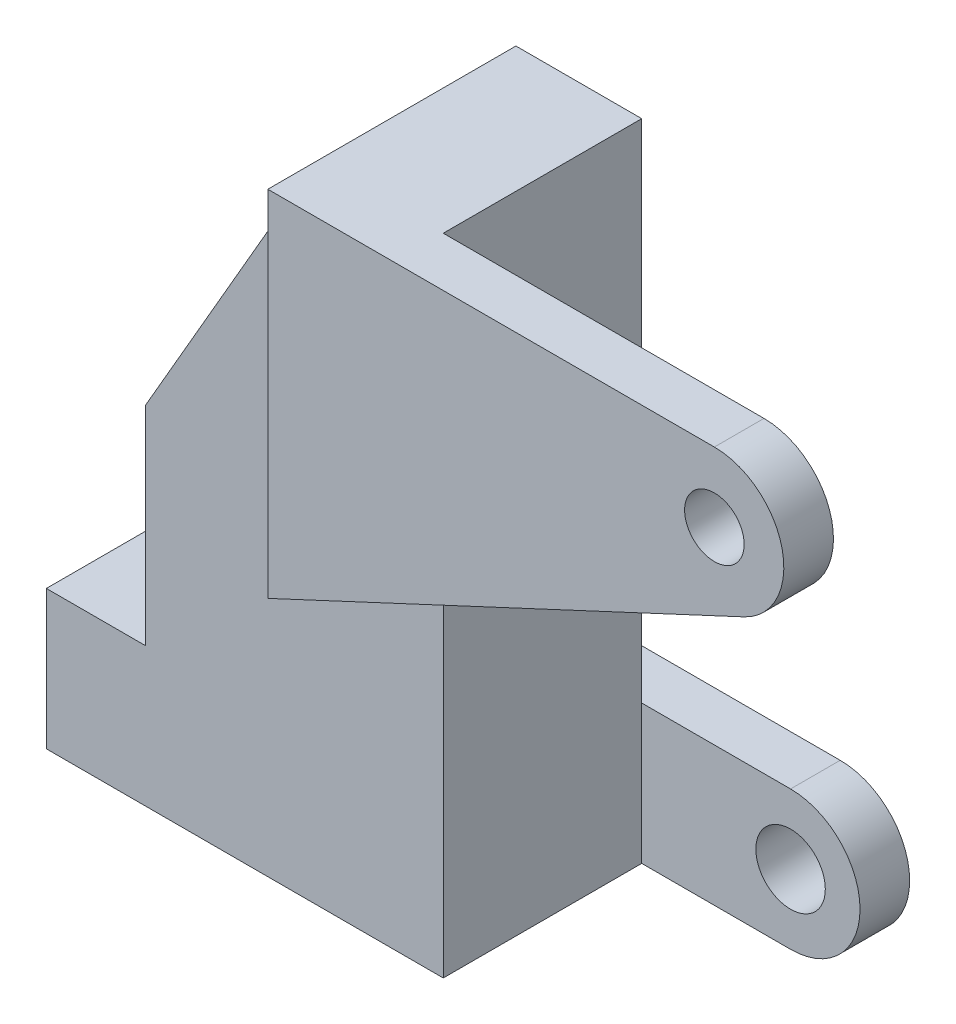
ISO-10303-21;
HEADER;
FILE_DESCRIPTION(('STEP AP214'),'2;1');
FILE_NAME('part.step','',(''),(''),'','','');
FILE_SCHEMA(('AUTOMOTIVE_DESIGN { 1 0 10303 214 1 1 1 1 }'));
ENDSEC;
DATA;
#1=APPLICATION_CONTEXT('core data for automotive mechanical design processes');
#2=APPLICATION_PROTOCOL_DEFINITION('international standard','automotive_design',2000,#1);
#3=PRODUCT_CONTEXT('',#1,'mechanical');
#4=PRODUCT('Part','Part','',(#3));
#5=PRODUCT_RELATED_PRODUCT_CATEGORY('part','',(#4));
#6=PRODUCT_DEFINITION_FORMATION('','',#4);
#7=PRODUCT_DEFINITION_CONTEXT('part definition',#1,'design');
#8=PRODUCT_DEFINITION('design','',#6,#7);
#9=PRODUCT_DEFINITION_SHAPE('','',#8);
#10=(LENGTH_UNIT() NAMED_UNIT(*) SI_UNIT(.MILLI.,.METRE.));
#11=(NAMED_UNIT(*) PLANE_ANGLE_UNIT() SI_UNIT($,.RADIAN.));
#12=(NAMED_UNIT(*) SI_UNIT($,.STERADIAN.) SOLID_ANGLE_UNIT());
#13=UNCERTAINTY_MEASURE_WITH_UNIT(LENGTH_MEASURE(1.E-05),#10,'distance_accuracy_value','');
#14=(GEOMETRIC_REPRESENTATION_CONTEXT(3) GLOBAL_UNCERTAINTY_ASSIGNED_CONTEXT((#13)) GLOBAL_UNIT_ASSIGNED_CONTEXT((#10,
#11,#12)) REPRESENTATION_CONTEXT('',''));
#15=CARTESIAN_POINT('',(0.,0.,0.));
#16=DIRECTION('',(0.,0.,1.));
#17=DIRECTION('',(1.,0.,0.));
#18=AXIS2_PLACEMENT_3D('',#15,#16,#17);
#19=CARTESIAN_POINT('',(0.,0.,0.));
#20=DIRECTION('',(0.,0.,1.));
#21=DIRECTION('',(1.,0.,0.));
#22=AXIS2_PLACEMENT_3D('',#19,#20,#21);
#23=PLANE('',#22);
#24=DIRECTION('',(1.,0.,0.));
#25=VECTOR('',#24,1.);
#26=CARTESIAN_POINT('',(0.,65.,0.));
#27=LINE('',#26,#25);
#28=CARTESIAN_POINT('',(27.3205080756888,65.,0.));
#29=VERTEX_POINT('',#28);
#30=CARTESIAN_POINT('',(40.,65.,0.));
#31=VERTEX_POINT('',#30);
#32=EDGE_CURVE('E196',#29,#31,#27,.T.);
#33=ORIENTED_EDGE('',*,*,#32,.T.);
#34=DIRECTION('',(0.,1.,0.));
#35=VECTOR('',#34,1.);
#36=CARTESIAN_POINT('',(40.,0.,0.));
#37=LINE('',#36,#35);
#38=CARTESIAN_POINT('',(40.,14.,0.));
#39=VERTEX_POINT('',#38);
#40=EDGE_CURVE('E172',#39,#31,#37,.T.);
#41=ORIENTED_EDGE('',*,*,#40,.F.);
#42=DIRECTION('',(1.,0.,0.));
#43=VECTOR('',#42,1.);
#44=CARTESIAN_POINT('',(0.,14.,0.));
#45=LINE('',#44,#43);
#46=CARTESIAN_POINT('',(10.,14.,0.));
#47=VERTEX_POINT('',#46);
#48=EDGE_CURVE('E286',#47,#39,#45,.T.);
#49=ORIENTED_EDGE('',*,*,#48,.F.);
#50=DIRECTION('',(0.,1.,0.));
#51=VECTOR('',#50,1.);
#52=CARTESIAN_POINT('',(10.,0.,0.));
#53=LINE('',#52,#51);
#54=CARTESIAN_POINT('',(10.,35.,0.));
#55=VERTEX_POINT('',#54);
#56=EDGE_CURVE('E204',#47,#55,#53,.T.);
#57=ORIENTED_EDGE('',*,*,#56,.T.);
#58=DIRECTION('',(0.500000000000001,0.866025403784438,0.));
#59=VECTOR('',#58,1.);
#60=CARTESIAN_POINT('',(-7.65544456622771,4.41987298107784,0.));
#61=LINE('',#60,#59);
#62=EDGE_CURVE('E203',#55,#29,#61,.T.);
#63=ORIENTED_EDGE('',*,*,#62,.T.);
#64=EDGE_LOOP('',(#33,#41,#49,#57,#63));
#65=FACE_BOUND('',#64,.T.);
#66=ADVANCED_FACE('F43',(#65),#23,.F.);
#67=CARTESIAN_POINT('',(0.,65.,20.));
#68=DIRECTION('',(0.,1.,0.));
#69=DIRECTION('',(0.,0.,1.));
#70=AXIS2_PLACEMENT_3D('',#67,#68,#69);
#71=PLANE('',#70);
#72=DIRECTION('',(1.,0.,0.));
#73=VECTOR('',#72,1.);
#74=CARTESIAN_POINT('',(0.,65.,20.));
#75=LINE('',#74,#73);
#76=CARTESIAN_POINT('',(40.,65.,20.));
#77=VERTEX_POINT('',#76);
#78=CARTESIAN_POINT('',(72.3205080756888,65.,20.));
#79=VERTEX_POINT('',#78);
#80=EDGE_CURVE('E59',#77,#79,#75,.T.);
#81=ORIENTED_EDGE('',*,*,#80,.F.);
#82=DIRECTION('',(0.,0.,-1.));
#83=VECTOR('',#82,1.);
#84=CARTESIAN_POINT('',(40.,65.,20.));
#85=LINE('',#84,#83);
#86=EDGE_CURVE('E266',#77,#31,#85,.T.);
#87=ORIENTED_EDGE('',*,*,#86,.T.);
#88=ORIENTED_EDGE('',*,*,#32,.F.);
#89=DIRECTION('',(0.,0.,-1.));
#90=VECTOR('',#89,1.);
#91=CARTESIAN_POINT('',(27.3205080756888,65.,20.));
#92=LINE('',#91,#90);
#93=CARTESIAN_POINT('',(27.3205080756888,65.,20.));
#94=VERTEX_POINT('',#93);
#95=EDGE_CURVE('E226',#94,#29,#92,.T.);
#96=ORIENTED_EDGE('',*,*,#95,.F.);
#97=DIRECTION('',(0.,0.,-1.));
#98=VECTOR('',#97,1.);
#99=CARTESIAN_POINT('',(27.3205080756888,65.,25.));
#100=LINE('',#99,#98);
#101=CARTESIAN_POINT('',(27.3205080756888,65.,25.));
#102=VERTEX_POINT('',#101);
#103=EDGE_CURVE('E180',#102,#94,#100,.T.);
#104=ORIENTED_EDGE('',*,*,#103,.F.);
#105=DIRECTION('',(1.,0.,0.));
#106=VECTOR('',#105,1.);
#107=CARTESIAN_POINT('',(0.,65.,25.));
#108=LINE('',#107,#106);
#109=CARTESIAN_POINT('',(72.3205080756888,65.,25.));
#110=VERTEX_POINT('',#109);
#111=EDGE_CURVE('E311',#102,#110,#108,.T.);
#112=ORIENTED_EDGE('',*,*,#111,.T.);
#113=DIRECTION('',(0.,0.,-1.));
#114=VECTOR('',#113,1.);
#115=CARTESIAN_POINT('',(72.3205080756888,65.,25.));
#116=LINE('',#115,#114);
#117=EDGE_CURVE('E174',#110,#79,#116,.T.);
#118=ORIENTED_EDGE('',*,*,#117,.T.);
#119=EDGE_LOOP('',(#81,#87,#88,#96,#104,#112,#118));
#120=FACE_BOUND('',#119,.T.);
#121=ADVANCED_FACE('F240',(#120),#71,.T.);
#122=CARTESIAN_POINT('',(40.,0.,20.));
#123=DIRECTION('',(-1.,0.,0.));
#124=DIRECTION('',(0.,0.,1.));
#125=AXIS2_PLACEMENT_3D('',#122,#123,#124);
#126=PLANE('',#125);
#127=ORIENTED_EDGE('',*,*,#40,.T.);
#128=ORIENTED_EDGE('',*,*,#86,.F.);
#129=DIRECTION('',(0.,1.,0.));
#130=VECTOR('',#129,1.);
#131=CARTESIAN_POINT('',(40.,0.,20.));
#132=LINE('',#131,#130);
#133=CARTESIAN_POINT('',(40.,35.2050541361085,20.));
#134=VERTEX_POINT('',#133);
#135=EDGE_CURVE('E264',#134,#77,#132,.T.);
#136=ORIENTED_EDGE('',*,*,#135,.F.);
#137=DIRECTION('',(0.,1.,0.));
#138=VECTOR('',#137,1.);
#139=CARTESIAN_POINT('',(40.,0.,20.));
#140=LINE('',#139,#138);
#141=CARTESIAN_POINT('',(40.,0.,20.));
#142=VERTEX_POINT('',#141);
#143=EDGE_CURVE('E182',#142,#134,#140,.T.);
#144=ORIENTED_EDGE('',*,*,#143,.F.);
#145=DIRECTION('',(0.,0.,-1.));
#146=VECTOR('',#145,1.);
#147=CARTESIAN_POINT('',(40.,0.,20.));
#148=LINE('',#147,#146);
#149=CARTESIAN_POINT('',(40.,0.,0.));
#150=VERTEX_POINT('',#149);
#151=EDGE_CURVE('E191',#142,#150,#148,.T.);
#152=ORIENTED_EDGE('',*,*,#151,.T.);
#153=EDGE_CURVE('E175',#150,#39,#37,.T.);
#154=ORIENTED_EDGE('',*,*,#153,.T.);
#155=EDGE_LOOP('',(#127,#128,#136,#144,#152,#154));
#156=FACE_BOUND('',#155,.T.);
#157=ADVANCED_FACE('F44',(#156),#126,.F.);
#158=CARTESIAN_POINT('',(0.,0.,20.));
#159=DIRECTION('',(0.,0.,1.));
#160=DIRECTION('',(1.,0.,0.));
#161=AXIS2_PLACEMENT_3D('',#158,#159,#160);
#162=PLANE('',#161);
#163=ORIENTED_EDGE('',*,*,#143,.T.);
#164=DIRECTION('',(-0.906307787036651,-0.422618261740697,0.));
#165=VECTOR('',#164,1.);
#166=CARTESIAN_POINT('',(-6.34007023906516,13.596324504192,20.));
#167=LINE('',#166,#165);
#168=CARTESIAN_POINT('',(27.3205080756888,29.2925099502878,20.));
#169=VERTEX_POINT('',#168);
#170=EDGE_CURVE('E11',#134,#169,#167,.T.);
#171=ORIENTED_EDGE('',*,*,#170,.T.);
#172=DIRECTION('',(0.,1.,0.));
#173=VECTOR('',#172,1.);
#174=CARTESIAN_POINT('',(27.3205080756888,0.,20.));
#175=LINE('',#174,#173);
#176=EDGE_CURVE('E51',#169,#94,#175,.T.);
#177=ORIENTED_EDGE('',*,*,#176,.T.);
#178=DIRECTION('',(0.500000000000001,0.866025403784438,0.));
#179=VECTOR('',#178,1.);
#180=CARTESIAN_POINT('',(-7.65544456622771,4.41987298107784,20.));
#181=LINE('',#180,#179);
#182=CARTESIAN_POINT('',(10.,35.,20.));
#183=VERTEX_POINT('',#182);
#184=EDGE_CURVE('E181',#183,#94,#181,.T.);
#185=ORIENTED_EDGE('',*,*,#184,.F.);
#186=DIRECTION('',(0.,1.,0.));
#187=VECTOR('',#186,1.);
#188=CARTESIAN_POINT('',(10.,0.,20.));
#189=LINE('',#188,#187);
#190=CARTESIAN_POINT('',(10.,14.,20.));
#191=VERTEX_POINT('',#190);
#192=EDGE_CURVE('E187',#191,#183,#189,.T.);
#193=ORIENTED_EDGE('',*,*,#192,.F.);
#194=DIRECTION('',(-1.,0.,0.));
#195=VECTOR('',#194,1.);
#196=CARTESIAN_POINT('',(0.,14.,20.));
#197=LINE('',#196,#195);
#198=CARTESIAN_POINT('',(0.,14.,20.));
#199=VERTEX_POINT('',#198);
#200=EDGE_CURVE('E190',#191,#199,#197,.T.);
#201=ORIENTED_EDGE('',*,*,#200,.T.);
#202=DIRECTION('',(0.,-1.,0.));
#203=VECTOR('',#202,1.);
#204=CARTESIAN_POINT('',(0.,0.,20.));
#205=LINE('',#204,#203);
#206=CARTESIAN_POINT('',(0.,0.,20.));
#207=VERTEX_POINT('',#206);
#208=EDGE_CURVE('E195',#199,#207,#205,.T.);
#209=ORIENTED_EDGE('',*,*,#208,.T.);
#210=DIRECTION('',(1.,0.,0.));
#211=VECTOR('',#210,1.);
#212=CARTESIAN_POINT('',(0.,0.,20.));
#213=LINE('',#212,#211);
#214=EDGE_CURVE('E194',#207,#142,#213,.T.);
#215=ORIENTED_EDGE('',*,*,#214,.T.);
#216=EDGE_LOOP('',(#163,#171,#177,#185,#193,#201,#209,#215));
#217=FACE_BOUND('',#216,.T.);
#218=ADVANCED_FACE('F232',(#217),#162,.T.);
#219=CARTESIAN_POINT('',(-7.65544456622771,4.41987298107784,20.));
#220=DIRECTION('',(-0.866025403784438,0.500000000000001,0.));
#221=DIRECTION('',(-0.500000000000001,-0.866025403784438,0.));
#222=AXIS2_PLACEMENT_3D('',#219,#220,#221);
#223=PLANE('',#222);
#224=ORIENTED_EDGE('',*,*,#62,.F.);
#225=DIRECTION('',(0.,0.,-1.));
#226=VECTOR('',#225,1.);
#227=CARTESIAN_POINT('',(10.,35.,20.));
#228=LINE('',#227,#226);
#229=EDGE_CURVE('E221',#183,#55,#228,.T.);
#230=ORIENTED_EDGE('',*,*,#229,.F.);
#231=ORIENTED_EDGE('',*,*,#184,.T.);
#232=ORIENTED_EDGE('',*,*,#95,.T.);
#233=EDGE_LOOP('',(#224,#230,#231,#232));
#234=FACE_BOUND('',#233,.T.);
#235=ADVANCED_FACE('F244',(#234),#223,.T.);
#236=CARTESIAN_POINT('',(10.,0.,20.));
#237=DIRECTION('',(-1.,0.,0.));
#238=DIRECTION('',(0.,-1.,0.));
#239=AXIS2_PLACEMENT_3D('',#236,#237,#238);
#240=PLANE('',#239);
#241=ORIENTED_EDGE('',*,*,#56,.F.);
#242=DIRECTION('',(0.,0.,-1.));
#243=VECTOR('',#242,1.);
#244=CARTESIAN_POINT('',(10.,14.,20.));
#245=LINE('',#244,#243);
#246=EDGE_CURVE('E222',#191,#47,#245,.T.);
#247=ORIENTED_EDGE('',*,*,#246,.F.);
#248=ORIENTED_EDGE('',*,*,#192,.T.);
#249=ORIENTED_EDGE('',*,*,#229,.T.);
#250=EDGE_LOOP('',(#241,#247,#248,#249));
#251=FACE_BOUND('',#250,.T.);
#252=ADVANCED_FACE('F247',(#251),#240,.T.);
#253=CARTESIAN_POINT('',(0.,14.,20.));
#254=DIRECTION('',(0.,-1.,0.));
#255=DIRECTION('',(0.,0.,-1.));
#256=AXIS2_PLACEMENT_3D('',#253,#254,#255);
#257=PLANE('',#256);
#258=DIRECTION('',(-1.,0.,0.));
#259=VECTOR('',#258,1.);
#260=CARTESIAN_POINT('',(0.,14.,0.));
#261=LINE('',#260,#259);
#262=CARTESIAN_POINT('',(0.,14.,0.));
#263=VERTEX_POINT('',#262);
#264=EDGE_CURVE('E210',#47,#263,#261,.T.);
#265=ORIENTED_EDGE('',*,*,#264,.T.);
#266=DIRECTION('',(0.,0.,-1.));
#267=VECTOR('',#266,1.);
#268=CARTESIAN_POINT('',(0.,14.,20.));
#269=LINE('',#268,#267);
#270=EDGE_CURVE('E217',#199,#263,#269,.T.);
#271=ORIENTED_EDGE('',*,*,#270,.F.);
#272=ORIENTED_EDGE('',*,*,#200,.F.);
#273=ORIENTED_EDGE('',*,*,#246,.T.);
#274=EDGE_LOOP('',(#265,#271,#272,#273));
#275=FACE_BOUND('',#274,.T.);
#276=ADVANCED_FACE('F252',(#275),#257,.F.);
#277=CARTESIAN_POINT('',(0.,0.,20.));
#278=DIRECTION('',(1.,0.,0.));
#279=DIRECTION('',(0.,0.,-1.));
#280=AXIS2_PLACEMENT_3D('',#277,#278,#279);
#281=PLANE('',#280);
#282=DIRECTION('',(0.,-1.,0.));
#283=VECTOR('',#282,1.);
#284=CARTESIAN_POINT('',(0.,0.,0.));
#285=LINE('',#284,#283);
#286=CARTESIAN_POINT('',(0.,0.,0.));
#287=VERTEX_POINT('',#286);
#288=EDGE_CURVE('E207',#263,#287,#285,.T.);
#289=ORIENTED_EDGE('',*,*,#288,.T.);
#290=DIRECTION('',(0.,0.,-1.));
#291=VECTOR('',#290,1.);
#292=CARTESIAN_POINT('',(0.,0.,20.));
#293=LINE('',#292,#291);
#294=EDGE_CURVE('E214',#207,#287,#293,.T.);
#295=ORIENTED_EDGE('',*,*,#294,.F.);
#296=ORIENTED_EDGE('',*,*,#208,.F.);
#297=ORIENTED_EDGE('',*,*,#270,.T.);
#298=EDGE_LOOP('',(#289,#295,#296,#297));
#299=FACE_BOUND('',#298,.T.);
#300=ADVANCED_FACE('F258',(#299),#281,.F.);
#301=CARTESIAN_POINT('',(0.,0.,20.));
#302=DIRECTION('',(0.,1.,0.));
#303=DIRECTION('',(0.,0.,1.));
#304=AXIS2_PLACEMENT_3D('',#301,#302,#303);
#305=PLANE('',#304);
#306=DIRECTION('',(1.,0.,0.));
#307=VECTOR('',#306,1.);
#308=CARTESIAN_POINT('',(0.,0.,0.));
#309=LINE('',#308,#307);
#310=CARTESIAN_POINT('',(10.,0.,0.));
#311=VERTEX_POINT('',#310);
#312=EDGE_CURVE('E184',#287,#311,#309,.T.);
#313=ORIENTED_EDGE('',*,*,#312,.T.);
#314=DIRECTION('',(0.,0.,1.));
#315=VECTOR('',#314,1.);
#316=CARTESIAN_POINT('',(10.,0.,-5.));
#317=LINE('',#316,#315);
#318=CARTESIAN_POINT('',(10.,0.,-5.));
#319=VERTEX_POINT('',#318);
#320=EDGE_CURVE('E67',#319,#311,#317,.T.);
#321=ORIENTED_EDGE('',*,*,#320,.F.);
#322=DIRECTION('',(1.,0.,0.));
#323=VECTOR('',#322,1.);
#324=CARTESIAN_POINT('',(0.,0.,-5.));
#325=LINE('',#324,#323);
#326=CARTESIAN_POINT('',(55.,0.,-5.));
#327=VERTEX_POINT('',#326);
#328=EDGE_CURVE('E278',#319,#327,#325,.T.);
#329=ORIENTED_EDGE('',*,*,#328,.T.);
#330=DIRECTION('',(0.,0.,1.));
#331=VECTOR('',#330,1.);
#332=CARTESIAN_POINT('',(55.,0.,-5.));
#333=LINE('',#332,#331);
#334=CARTESIAN_POINT('',(55.,0.,0.));
#335=VERTEX_POINT('',#334);
#336=EDGE_CURVE('E308',#327,#335,#333,.T.);
#337=ORIENTED_EDGE('',*,*,#336,.T.);
#338=DIRECTION('',(1.,0.,0.));
#339=VECTOR('',#338,1.);
#340=CARTESIAN_POINT('',(0.,0.,0.));
#341=LINE('',#340,#339);
#342=EDGE_CURVE('E293',#150,#335,#341,.T.);
#343=ORIENTED_EDGE('',*,*,#342,.F.);
#344=ORIENTED_EDGE('',*,*,#151,.F.);
#345=ORIENTED_EDGE('',*,*,#214,.F.);
#346=ORIENTED_EDGE('',*,*,#294,.T.);
#347=EDGE_LOOP('',(#313,#321,#329,#337,#343,#344,#345,#346));
#348=FACE_BOUND('',#347,.T.);
#349=ADVANCED_FACE('F261',(#348),#305,.F.);
#350=ORIENTED_EDGE('',*,*,#264,.F.);
#351=DIRECTION('',(0.,-1.,0.));
#352=VECTOR('',#351,1.);
#353=CARTESIAN_POINT('',(10.,0.,0.));
#354=LINE('',#353,#352);
#355=EDGE_CURVE('E291',#47,#311,#354,.T.);
#356=ORIENTED_EDGE('',*,*,#355,.T.);
#357=ORIENTED_EDGE('',*,*,#312,.F.);
#358=ORIENTED_EDGE('',*,*,#288,.F.);
#359=EDGE_LOOP('',(#350,#356,#357,#358));
#360=FACE_BOUND('',#359,.T.);
#361=ADVANCED_FACE('F332',(#360),#23,.F.);
#362=CARTESIAN_POINT('',(-6.34007023906516,13.596324504192,25.));
#363=DIRECTION('',(-0.422618261740697,0.906307787036651,0.));
#364=DIRECTION('',(-0.906307787036651,-0.422618261740697,0.));
#365=AXIS2_PLACEMENT_3D('',#362,#363,#364);
#366=PLANE('',#365);
#367=ORIENTED_EDGE('',*,*,#170,.F.);
#368=DIRECTION('',(0.906307787036651,0.422618261740697,0.));
#369=VECTOR('',#368,1.);
#370=CARTESIAN_POINT('',(-6.34007023906516,13.596324504192,20.));
#371=LINE('',#370,#369);
#372=CARTESIAN_POINT('',(75.2788359078737,51.6558454907434,20.));
#373=VERTEX_POINT('',#372);
#374=EDGE_CURVE('E153',#134,#373,#371,.T.);
#375=ORIENTED_EDGE('',*,*,#374,.T.);
#376=DIRECTION('',(0.,0.,-1.));
#377=VECTOR('',#376,1.);
#378=CARTESIAN_POINT('',(75.2788359078737,51.6558454907434,25.));
#379=LINE('',#378,#377);
#380=CARTESIAN_POINT('',(75.2788359078737,51.6558454907434,25.));
#381=VERTEX_POINT('',#380);
#382=EDGE_CURVE('E164',#381,#373,#379,.T.);
#383=ORIENTED_EDGE('',*,*,#382,.F.);
#384=DIRECTION('',(0.906307787036651,0.422618261740697,0.));
#385=VECTOR('',#384,1.);
#386=CARTESIAN_POINT('',(-6.34007023906516,13.596324504192,25.));
#387=LINE('',#386,#385);
#388=CARTESIAN_POINT('',(27.3205080756888,29.2925099502878,25.));
#389=VERTEX_POINT('',#388);
#390=EDGE_CURVE('E301',#389,#381,#387,.T.);
#391=ORIENTED_EDGE('',*,*,#390,.F.);
#392=DIRECTION('',(0.,0.,-1.));
#393=VECTOR('',#392,1.);
#394=CARTESIAN_POINT('',(27.3205080756888,29.2925099502878,25.));
#395=LINE('',#394,#393);
#396=EDGE_CURVE('E319',#389,#169,#395,.T.);
#397=ORIENTED_EDGE('',*,*,#396,.T.);
#398=EDGE_LOOP('',(#367,#375,#383,#391,#397));
#399=FACE_BOUND('',#398,.T.);
#400=ADVANCED_FACE('F162',(#399),#366,.F.);
#401=CARTESIAN_POINT('',(72.3205080756888,58.,25.));
#402=DIRECTION('',(0.,0.,-1.));
#403=DIRECTION('',(-1.,0.,0.));
#404=AXIS2_PLACEMENT_3D('',#401,#402,#403);
#405=CYLINDRICAL_SURFACE('',#404,7.);
#406=ORIENTED_EDGE('',*,*,#382,.T.);
#407=CARTESIAN_POINT('',(72.3205080756888,58.,20.));
#408=DIRECTION('',(0.,0.,1.));
#409=DIRECTION('',(1.,0.,0.));
#410=AXIS2_PLACEMENT_3D('',#407,#408,#409);
#411=CIRCLE('',#410,7.);
#412=EDGE_CURVE('E149',#373,#79,#411,.T.);
#413=ORIENTED_EDGE('',*,*,#412,.T.);
#414=ORIENTED_EDGE('',*,*,#117,.F.);
#415=CARTESIAN_POINT('',(72.3205080756888,58.,25.));
#416=DIRECTION('',(0.,0.,1.));
#417=DIRECTION('',(1.,0.,0.));
#418=AXIS2_PLACEMENT_3D('',#415,#416,#417);
#419=CIRCLE('',#418,7.);
#420=EDGE_CURVE('E168',#381,#110,#419,.T.);
#421=ORIENTED_EDGE('',*,*,#420,.F.);
#422=EDGE_LOOP('',(#406,#413,#414,#421));
#423=FACE_BOUND('',#422,.T.);
#424=ADVANCED_FACE('F166',(#423),#405,.T.);
#425=CARTESIAN_POINT('',(27.3205080756888,0.,25.));
#426=DIRECTION('',(1.,0.,0.));
#427=DIRECTION('',(0.,1.,0.));
#428=AXIS2_PLACEMENT_3D('',#425,#426,#427);
#429=PLANE('',#428);
#430=ORIENTED_EDGE('',*,*,#176,.F.);
#431=ORIENTED_EDGE('',*,*,#396,.F.);
#432=DIRECTION('',(0.,-1.,0.));
#433=VECTOR('',#432,1.);
#434=CARTESIAN_POINT('',(27.3205080756888,0.,25.));
#435=LINE('',#434,#433);
#436=EDGE_CURVE('E312',#102,#389,#435,.T.);
#437=ORIENTED_EDGE('',*,*,#436,.F.);
#438=ORIENTED_EDGE('',*,*,#103,.T.);
#439=EDGE_LOOP('',(#430,#431,#437,#438));
#440=FACE_BOUND('',#439,.T.);
#441=ADVANCED_FACE('F321',(#440),#429,.F.);
#442=CARTESIAN_POINT('',(72.3205080756888,58.,25.));
#443=DIRECTION('',(0.,0.,-1.));
#444=DIRECTION('',(-1.,0.,0.));
#445=AXIS2_PLACEMENT_3D('',#442,#443,#444);
#446=CYLINDRICAL_SURFACE('',#445,3.00000000000001);
#447=CARTESIAN_POINT('',(72.3205080756888,58.,20.));
#448=DIRECTION('',(0.,0.,1.));
#449=DIRECTION('',(1.,0.,0.));
#450=AXIS2_PLACEMENT_3D('',#447,#448,#449);
#451=CIRCLE('',#450,3.00000000000001);
#452=CARTESIAN_POINT('',(75.3205080756888,58.,20.));
#453=VERTEX_POINT('',#452);
#454=EDGE_CURVE('E270',#453,#453,#451,.T.);
#455=ORIENTED_EDGE('',*,*,#454,.F.);
#456=EDGE_LOOP('',(#455));
#457=FACE_BOUND('',#456,.T.);
#458=CARTESIAN_POINT('',(72.3205080756888,58.,25.));
#459=DIRECTION('',(0.,0.,1.));
#460=DIRECTION('',(1.,0.,0.));
#461=AXIS2_PLACEMENT_3D('',#458,#459,#460);
#462=CIRCLE('',#461,3.00000000000001);
#463=CARTESIAN_POINT('',(75.3205080756888,58.,25.));
#464=VERTEX_POINT('',#463);
#465=EDGE_CURVE('E320',#464,#464,#462,.T.);
#466=ORIENTED_EDGE('',*,*,#465,.T.);
#467=EDGE_LOOP('',(#466));
#468=FACE_BOUND('',#467,.T.);
#469=ADVANCED_FACE('F357',(#457,#468),#446,.F.);
#470=CARTESIAN_POINT('',(0.,0.,25.));
#471=DIRECTION('',(0.,0.,1.));
#472=DIRECTION('',(1.,0.,0.));
#473=AXIS2_PLACEMENT_3D('',#470,#471,#472);
#474=PLANE('',#473);
#475=ORIENTED_EDGE('',*,*,#390,.T.);
#476=ORIENTED_EDGE('',*,*,#420,.T.);
#477=ORIENTED_EDGE('',*,*,#111,.F.);
#478=ORIENTED_EDGE('',*,*,#436,.T.);
#479=EDGE_LOOP('',(#475,#476,#477,#478));
#480=FACE_BOUND('',#479,.T.);
#481=ORIENTED_EDGE('',*,*,#465,.F.);
#482=EDGE_LOOP('',(#481));
#483=FACE_BOUND('',#482,.T.);
#484=ADVANCED_FACE('F322',(#480,#483),#474,.T.);
#485=CARTESIAN_POINT('',(0.,0.,0.));
#486=DIRECTION('',(0.,0.,1.));
#487=DIRECTION('',(1.,0.,0.));
#488=AXIS2_PLACEMENT_3D('',#485,#486,#487);
#489=PLANE('',#488);
#490=CARTESIAN_POINT('',(55.,7.,0.));
#491=DIRECTION('',(0.,0.,1.));
#492=DIRECTION('',(1.,0.,0.));
#493=AXIS2_PLACEMENT_3D('',#490,#491,#492);
#494=CIRCLE('',#493,3.5);
#495=CARTESIAN_POINT('',(58.5,7.,0.));
#496=VERTEX_POINT('',#495);
#497=EDGE_CURVE('E279',#496,#496,#494,.T.);
#498=ORIENTED_EDGE('',*,*,#497,.F.);
#499=EDGE_LOOP('',(#498));
#500=FACE_BOUND('',#499,.T.);
#501=ORIENTED_EDGE('',*,*,#153,.F.);
#502=ORIENTED_EDGE('',*,*,#342,.T.);
#503=CARTESIAN_POINT('',(55.,7.,0.));
#504=DIRECTION('',(0.,0.,1.));
#505=DIRECTION('',(1.,0.,0.));
#506=AXIS2_PLACEMENT_3D('',#503,#504,#505);
#507=CIRCLE('',#506,7.);
#508=CARTESIAN_POINT('',(55.,14.,0.));
#509=VERTEX_POINT('',#508);
#510=EDGE_CURVE('E297',#335,#509,#507,.T.);
#511=ORIENTED_EDGE('',*,*,#510,.T.);
#512=EDGE_CURVE('E273',#39,#509,#45,.T.);
#513=ORIENTED_EDGE('',*,*,#512,.F.);
#514=EDGE_LOOP('',(#501,#502,#511,#513));
#515=FACE_BOUND('',#514,.T.);
#516=ADVANCED_FACE('F347',(#500,#515),#489,.T.);
#517=CARTESIAN_POINT('',(0.,14.,-5.));
#518=DIRECTION('',(0.,-1.,0.));
#519=DIRECTION('',(1.,0.,0.));
#520=AXIS2_PLACEMENT_3D('',#517,#518,#519);
#521=PLANE('',#520);
#522=ORIENTED_EDGE('',*,*,#48,.T.);
#523=ORIENTED_EDGE('',*,*,#512,.T.);
#524=DIRECTION('',(0.,0.,1.));
#525=VECTOR('',#524,1.);
#526=CARTESIAN_POINT('',(55.,14.,-5.));
#527=LINE('',#526,#525);
#528=CARTESIAN_POINT('',(55.,14.,-5.));
#529=VERTEX_POINT('',#528);
#530=EDGE_CURVE('E305',#529,#509,#527,.T.);
#531=ORIENTED_EDGE('',*,*,#530,.F.);
#532=DIRECTION('',(1.,0.,0.));
#533=VECTOR('',#532,1.);
#534=CARTESIAN_POINT('',(0.,14.,-5.));
#535=LINE('',#534,#533);
#536=CARTESIAN_POINT('',(10.,14.,-5.));
#537=VERTEX_POINT('',#536);
#538=EDGE_CURVE('E274',#537,#529,#535,.T.);
#539=ORIENTED_EDGE('',*,*,#538,.F.);
#540=DIRECTION('',(0.,0.,1.));
#541=VECTOR('',#540,1.);
#542=CARTESIAN_POINT('',(10.,14.,-5.));
#543=LINE('',#542,#541);
#544=EDGE_CURVE('E289',#537,#47,#543,.T.);
#545=ORIENTED_EDGE('',*,*,#544,.T.);
#546=EDGE_LOOP('',(#522,#523,#531,#539,#545));
#547=FACE_BOUND('',#546,.T.);
#548=ADVANCED_FACE('F342',(#547),#521,.F.);
#549=CARTESIAN_POINT('',(55.,7.,-5.));
#550=DIRECTION('',(0.,0.,1.));
#551=DIRECTION('',(1.,0.,0.));
#552=AXIS2_PLACEMENT_3D('',#549,#550,#551);
#553=CYLINDRICAL_SURFACE('',#552,7.);
#554=ORIENTED_EDGE('',*,*,#510,.F.);
#555=ORIENTED_EDGE('',*,*,#336,.F.);
#556=CARTESIAN_POINT('',(55.,7.,-5.));
#557=DIRECTION('',(0.,0.,1.));
#558=DIRECTION('',(1.,0.,0.));
#559=AXIS2_PLACEMENT_3D('',#556,#557,#558);
#560=CIRCLE('',#559,7.);
#561=EDGE_CURVE('E284',#327,#529,#560,.T.);
#562=ORIENTED_EDGE('',*,*,#561,.T.);
#563=ORIENTED_EDGE('',*,*,#530,.T.);
#564=EDGE_LOOP('',(#554,#555,#562,#563));
#565=FACE_BOUND('',#564,.T.);
#566=ADVANCED_FACE('F344',(#565),#553,.T.);
#567=CARTESIAN_POINT('',(10.,0.,-5.));
#568=DIRECTION('',(-1.,0.,0.));
#569=DIRECTION('',(0.,0.,1.));
#570=AXIS2_PLACEMENT_3D('',#567,#568,#569);
#571=PLANE('',#570);
#572=ORIENTED_EDGE('',*,*,#355,.F.);
#573=ORIENTED_EDGE('',*,*,#544,.F.);
#574=DIRECTION('',(0.,-1.,0.));
#575=VECTOR('',#574,1.);
#576=CARTESIAN_POINT('',(10.,0.,-5.));
#577=LINE('',#576,#575);
#578=EDGE_CURVE('E280',#537,#319,#577,.T.);
#579=ORIENTED_EDGE('',*,*,#578,.T.);
#580=ORIENTED_EDGE('',*,*,#320,.T.);
#581=EDGE_LOOP('',(#572,#573,#579,#580));
#582=FACE_BOUND('',#581,.T.);
#583=ADVANCED_FACE('F339',(#582),#571,.T.);
#584=CARTESIAN_POINT('',(55.,7.,-5.));
#585=DIRECTION('',(0.,0.,1.));
#586=DIRECTION('',(1.,0.,0.));
#587=AXIS2_PLACEMENT_3D('',#584,#585,#586);
#588=CYLINDRICAL_SURFACE('',#587,3.5);
#589=CARTESIAN_POINT('',(55.,7.,-5.));
#590=DIRECTION('',(0.,0.,1.));
#591=DIRECTION('',(1.,0.,0.));
#592=AXIS2_PLACEMENT_3D('',#589,#590,#591);
#593=CIRCLE('',#592,3.5);
#594=CARTESIAN_POINT('',(58.5,7.,-5.));
#595=VERTEX_POINT('',#594);
#596=EDGE_CURVE('E287',#595,#595,#593,.T.);
#597=ORIENTED_EDGE('',*,*,#596,.F.);
#598=EDGE_LOOP('',(#597));
#599=FACE_BOUND('',#598,.T.);
#600=ORIENTED_EDGE('',*,*,#497,.T.);
#601=EDGE_LOOP('',(#600));
#602=FACE_BOUND('',#601,.T.);
#603=ADVANCED_FACE('F396',(#599,#602),#588,.F.);
#604=CARTESIAN_POINT('',(0.,0.,-5.));
#605=DIRECTION('',(0.,0.,1.));
#606=DIRECTION('',(1.,0.,0.));
#607=AXIS2_PLACEMENT_3D('',#604,#605,#606);
#608=PLANE('',#607);
#609=ORIENTED_EDGE('',*,*,#538,.T.);
#610=ORIENTED_EDGE('',*,*,#561,.F.);
#611=ORIENTED_EDGE('',*,*,#328,.F.);
#612=ORIENTED_EDGE('',*,*,#578,.F.);
#613=EDGE_LOOP('',(#609,#610,#611,#612));
#614=FACE_BOUND('',#613,.T.);
#615=ORIENTED_EDGE('',*,*,#596,.T.);
#616=EDGE_LOOP('',(#615));
#617=FACE_BOUND('',#616,.T.);
#618=ADVANCED_FACE('F336',(#614,#617),#608,.F.);
#619=CARTESIAN_POINT('',(0.,0.,20.));
#620=DIRECTION('',(0.,0.,1.));
#621=DIRECTION('',(1.,0.,0.));
#622=AXIS2_PLACEMENT_3D('',#619,#620,#621);
#623=PLANE('',#622);
#624=ORIENTED_EDGE('',*,*,#374,.F.);
#625=ORIENTED_EDGE('',*,*,#135,.T.);
#626=ORIENTED_EDGE('',*,*,#80,.T.);
#627=ORIENTED_EDGE('',*,*,#412,.F.);
#628=EDGE_LOOP('',(#624,#625,#626,#627));
#629=FACE_BOUND('',#628,.T.);
#630=ORIENTED_EDGE('',*,*,#454,.T.);
#631=EDGE_LOOP('',(#630));
#632=FACE_BOUND('',#631,.T.);
#633=ADVANCED_FACE('F151',(#629,#632),#623,.F.);
#634=CLOSED_SHELL('',(#66,#121,#157,#218,#235,#252,#276,#300,#349,#361,#400,#424,#441,#469,#484,
#516,#548,#566,#583,#603,#618,#633));
#635=MANIFOLD_SOLID_BREP('B2',#634);
#636=ADVANCED_BREP_SHAPE_REPRESENTATION('',(#18,#635),#14);
#637=SHAPE_DEFINITION_REPRESENTATION(#9,#636);
ENDSEC;
END-ISO-10303-21;
